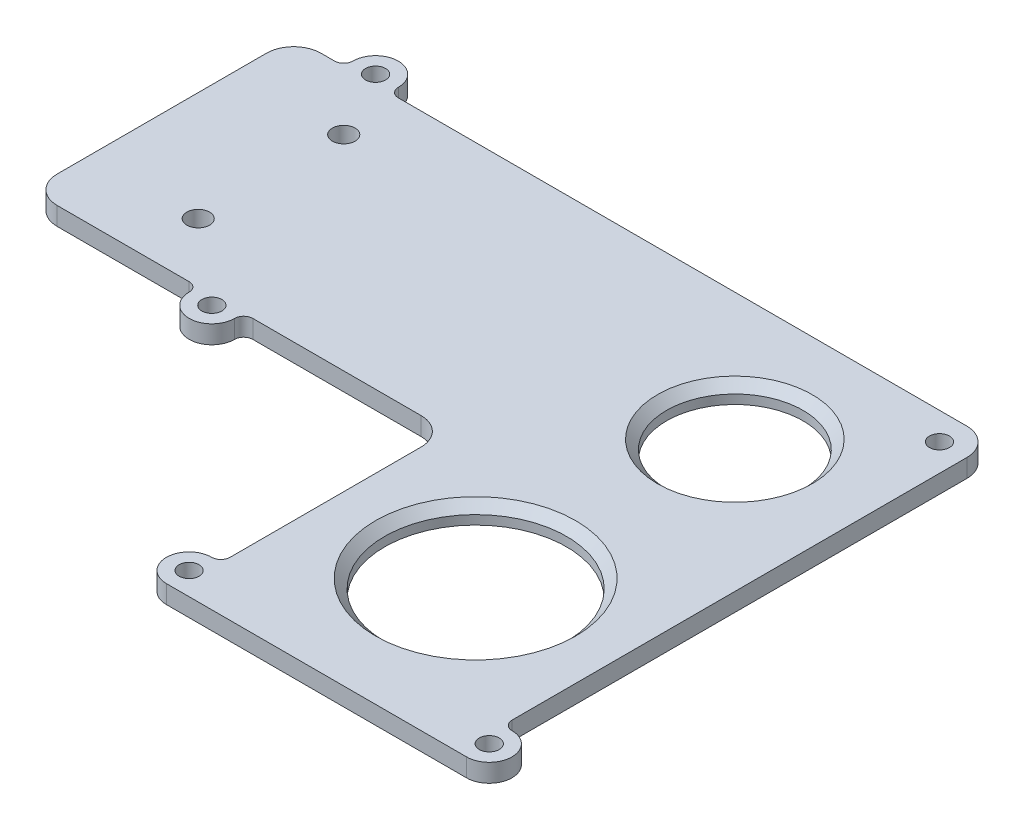
ISO-10303-21;
HEADER;
FILE_DESCRIPTION(('STEP AP214'),'2;1');
FILE_NAME('part.step','',(''),(''),'','','');
FILE_SCHEMA(('AUTOMOTIVE_DESIGN { 1 0 10303 214 1 1 1 1 }'));
ENDSEC;
DATA;
#1=APPLICATION_CONTEXT('core data for automotive mechanical design processes');
#2=APPLICATION_PROTOCOL_DEFINITION('international standard','automotive_design',2000,#1);
#3=PRODUCT_CONTEXT('',#1,'mechanical');
#4=PRODUCT('Part','Part','',(#3));
#5=PRODUCT_RELATED_PRODUCT_CATEGORY('part','',(#4));
#6=PRODUCT_DEFINITION_FORMATION('','',#4);
#7=PRODUCT_DEFINITION_CONTEXT('part definition',#1,'design');
#8=PRODUCT_DEFINITION('design','',#6,#7);
#9=PRODUCT_DEFINITION_SHAPE('','',#8);
#10=(LENGTH_UNIT() NAMED_UNIT(*) SI_UNIT(.MILLI.,.METRE.));
#11=(NAMED_UNIT(*) PLANE_ANGLE_UNIT() SI_UNIT($,.RADIAN.));
#12=(NAMED_UNIT(*) SI_UNIT($,.STERADIAN.) SOLID_ANGLE_UNIT());
#13=UNCERTAINTY_MEASURE_WITH_UNIT(LENGTH_MEASURE(1.E-05),#10,'distance_accuracy_value','');
#14=(GEOMETRIC_REPRESENTATION_CONTEXT(3) GLOBAL_UNCERTAINTY_ASSIGNED_CONTEXT((#13)) GLOBAL_UNIT_ASSIGNED_CONTEXT((#10,
#11,#12)) REPRESENTATION_CONTEXT('',''));
#15=CARTESIAN_POINT('',(0.,0.,0.));
#16=DIRECTION('',(0.,0.,1.));
#17=DIRECTION('',(1.,0.,0.));
#18=AXIS2_PLACEMENT_3D('',#15,#16,#17);
#19=CARTESIAN_POINT('',(32.,2.,-2.49999999999999));
#20=DIRECTION('',(0.,1.,0.));
#21=DIRECTION('',(0.,0.,1.));
#22=AXIS2_PLACEMENT_3D('',#19,#20,#21);
#23=PLANE('',#22);
#24=CARTESIAN_POINT('',(-34.,2.,-52.5));
#25=DIRECTION('',(0.,1.,0.));
#26=DIRECTION('',(0.,0.,1.));
#27=AXIS2_PLACEMENT_3D('',#24,#25,#26);
#28=CIRCLE('',#27,1.25);
#29=CARTESIAN_POINT('',(-34.,2.,-51.25));
#30=VERTEX_POINT('',#29);
#31=EDGE_CURVE('E862',#30,#30,#28,.T.);
#32=ORIENTED_EDGE('',*,*,#31,.F.);
#33=EDGE_LOOP('',(#32));
#34=FACE_BOUND('',#33,.T.);
#35=CARTESIAN_POINT('',(-34.,2.,-36.5));
#36=DIRECTION('',(0.,1.,0.));
#37=DIRECTION('',(0.,0.,1.));
#38=AXIS2_PLACEMENT_3D('',#35,#36,#37);
#39=CIRCLE('',#38,1.25);
#40=CARTESIAN_POINT('',(-34.,2.,-35.25));
#41=VERTEX_POINT('',#40);
#42=EDGE_CURVE('E863',#41,#41,#39,.T.);
#43=ORIENTED_EDGE('',*,*,#42,.F.);
#44=EDGE_LOOP('',(#43));
#45=FACE_BOUND('',#44,.T.);
#46=CARTESIAN_POINT('',(16.4999999999999,2.,-45.0000000000001));
#47=DIRECTION('',(0.,1.,0.));
#48=DIRECTION('',(0.,0.,1.));
#49=AXIS2_PLACEMENT_3D('',#46,#47,#48);
#50=CIRCLE('',#49,8.50000000000001);
#51=CARTESIAN_POINT('',(16.4999999999999,2.,-36.5000000000001));
#52=VERTEX_POINT('',#51);
#53=EDGE_CURVE('E49',#52,#52,#50,.F.);
#54=ORIENTED_EDGE('',*,*,#53,.T.);
#55=EDGE_LOOP('',(#54));
#56=FACE_BOUND('',#55,.T.);
#57=CARTESIAN_POINT('',(15.5,2.,-17.5));
#58=DIRECTION('',(0.,1.,0.));
#59=DIRECTION('',(0.,0.,1.));
#60=AXIS2_PLACEMENT_3D('',#57,#58,#59);
#61=CIRCLE('',#60,11.);
#62=CARTESIAN_POINT('',(15.5,2.,-6.49999999999998));
#63=VERTEX_POINT('',#62);
#64=EDGE_CURVE('E324',#63,#63,#61,.F.);
#65=ORIENTED_EDGE('',*,*,#64,.T.);
#66=EDGE_LOOP('',(#65));
#67=FACE_BOUND('',#66,.T.);
#68=CARTESIAN_POINT('',(-25.,2.,-29.));
#69=DIRECTION('',(0.,1.,0.));
#70=DIRECTION('',(0.,0.,-1.));
#71=AXIS2_PLACEMENT_3D('',#68,#69,#70);
#72=CIRCLE('',#71,1.1);
#73=CARTESIAN_POINT('',(-25.,2.,-30.1));
#74=VERTEX_POINT('',#73);
#75=EDGE_CURVE('E879',#74,#74,#72,.T.);
#76=ORIENTED_EDGE('',*,*,#75,.F.);
#77=EDGE_LOOP('',(#76));
#78=FACE_BOUND('',#77,.T.);
#79=CARTESIAN_POINT('',(28.,2.,-56.));
#80=DIRECTION('',(0.,1.,0.));
#81=DIRECTION('',(0.,0.,1.));
#82=AXIS2_PLACEMENT_3D('',#79,#80,#81);
#83=CIRCLE('',#82,1.1);
#84=CARTESIAN_POINT('',(28.,2.,-54.9));
#85=VERTEX_POINT('',#84);
#86=EDGE_CURVE('E891',#85,#85,#83,.T.);
#87=ORIENTED_EDGE('',*,*,#86,.F.);
#88=EDGE_LOOP('',(#87));
#89=FACE_BOUND('',#88,.T.);
#90=DIRECTION('',(1.,0.,0.));
#91=VECTOR('',#90,1.);
#92=CARTESIAN_POINT('',(-0.999999999999987,2.,0.));
#93=LINE('',#92,#91);
#94=CARTESIAN_POINT('',(-0.999999999999987,2.,0.));
#95=VERTEX_POINT('',#94);
#96=CARTESIAN_POINT('',(32.,2.,0.));
#97=VERTEX_POINT('',#96);
#98=EDGE_CURVE('E141',#95,#97,#93,.T.);
#99=ORIENTED_EDGE('',*,*,#98,.T.);
#100=CARTESIAN_POINT('',(32.,2.,-2.49999999999999));
#101=DIRECTION('',(0.,1.,0.));
#102=DIRECTION('',(0.,0.,1.));
#103=AXIS2_PLACEMENT_3D('',#100,#101,#102);
#104=CIRCLE('',#103,2.5);
#105=CARTESIAN_POINT('',(32.,2.,-4.99999999999999));
#106=VERTEX_POINT('',#105);
#107=EDGE_CURVE('E357',#97,#106,#104,.T.);
#108=ORIENTED_EDGE('',*,*,#107,.T.);
#109=CARTESIAN_POINT('',(32.,2.,-5.99999999999999));
#110=DIRECTION('',(0.,-1.,0.));
#111=DIRECTION('',(0.,0.,-1.));
#112=AXIS2_PLACEMENT_3D('',#109,#110,#111);
#113=CIRCLE('',#112,0.999999999999999);
#114=CARTESIAN_POINT('',(31.,2.,-5.99999999999999));
#115=VERTEX_POINT('',#114);
#116=EDGE_CURVE('E359',#106,#115,#113,.T.);
#117=ORIENTED_EDGE('',*,*,#116,.T.);
#118=DIRECTION('',(0.,0.,-1.));
#119=VECTOR('',#118,1.);
#120=CARTESIAN_POINT('',(31.,2.,-5.99999999999999));
#121=LINE('',#120,#119);
#122=CARTESIAN_POINT('',(31.,2.,-56.));
#123=VERTEX_POINT('',#122);
#124=EDGE_CURVE('E361',#115,#123,#121,.T.);
#125=ORIENTED_EDGE('',*,*,#124,.T.);
#126=CARTESIAN_POINT('',(28.,2.,-56.));
#127=DIRECTION('',(0.,1.,0.));
#128=DIRECTION('',(0.,0.,1.));
#129=AXIS2_PLACEMENT_3D('',#126,#127,#128);
#130=CIRCLE('',#129,3.);
#131=CARTESIAN_POINT('',(28.,2.,-59.));
#132=VERTEX_POINT('',#131);
#133=EDGE_CURVE('E363',#123,#132,#130,.T.);
#134=ORIENTED_EDGE('',*,*,#133,.T.);
#135=DIRECTION('',(-1.,0.,0.));
#136=VECTOR('',#135,1.);
#137=CARTESIAN_POINT('',(28.,2.,-59.));
#138=LINE('',#137,#136);
#139=CARTESIAN_POINT('',(-34.5,2.,-59.));
#140=VERTEX_POINT('',#139);
#141=EDGE_CURVE('E365',#132,#140,#138,.T.);
#142=ORIENTED_EDGE('',*,*,#141,.T.);
#143=CARTESIAN_POINT('',(-34.5,2.,-60.));
#144=DIRECTION('',(0.,-1.,0.));
#145=DIRECTION('',(0.,0.,1.));
#146=AXIS2_PLACEMENT_3D('',#143,#144,#145);
#147=CIRCLE('',#146,1.00000000000003);
#148=CARTESIAN_POINT('',(-35.5,2.,-60.));
#149=VERTEX_POINT('',#148);
#150=EDGE_CURVE('E367',#140,#149,#147,.T.);
#151=ORIENTED_EDGE('',*,*,#150,.T.);
#152=CARTESIAN_POINT('',(-38.,2.,-60.));
#153=DIRECTION('',(0.,1.,0.));
#154=DIRECTION('',(0.,0.,1.));
#155=AXIS2_PLACEMENT_3D('',#152,#153,#154);
#156=CIRCLE('',#155,2.5);
#157=CARTESIAN_POINT('',(-40.5,2.,-60.));
#158=VERTEX_POINT('',#157);
#159=EDGE_CURVE('E369',#149,#158,#156,.T.);
#160=ORIENTED_EDGE('',*,*,#159,.T.);
#161=CARTESIAN_POINT('',(-41.5000000000001,2.,-60.));
#162=DIRECTION('',(0.,-1.,0.));
#163=DIRECTION('',(0.,0.,-1.));
#164=AXIS2_PLACEMENT_3D('',#161,#162,#163);
#165=CIRCLE('',#164,1.00000000000003);
#166=CARTESIAN_POINT('',(-41.5000000000001,2.,-59.));
#167=VERTEX_POINT('',#166);
#168=EDGE_CURVE('E371',#158,#167,#165,.T.);
#169=ORIENTED_EDGE('',*,*,#168,.T.);
#170=DIRECTION('',(-1.,0.,0.));
#171=VECTOR('',#170,1.);
#172=CARTESIAN_POINT('',(-41.5000000000001,2.,-59.));
#173=LINE('',#172,#171);
#174=CARTESIAN_POINT('',(-43.,2.,-59.));
#175=VERTEX_POINT('',#174);
#176=EDGE_CURVE('E373',#167,#175,#173,.T.);
#177=ORIENTED_EDGE('',*,*,#176,.T.);
#178=CARTESIAN_POINT('',(-43.,2.,-56.));
#179=DIRECTION('',(0.,1.,0.));
#180=DIRECTION('',(0.,0.,1.));
#181=AXIS2_PLACEMENT_3D('',#178,#179,#180);
#182=CIRCLE('',#181,3.00000000000001);
#183=CARTESIAN_POINT('',(-46.,2.,-56.));
#184=VERTEX_POINT('',#183);
#185=EDGE_CURVE('E375',#175,#184,#182,.T.);
#186=ORIENTED_EDGE('',*,*,#185,.T.);
#187=DIRECTION('',(0.,0.,1.));
#188=VECTOR('',#187,1.);
#189=CARTESIAN_POINT('',(-46.,2.,-56.));
#190=LINE('',#189,#188);
#191=CARTESIAN_POINT('',(-46.,2.,-33.));
#192=VERTEX_POINT('',#191);
#193=EDGE_CURVE('E377',#184,#192,#190,.T.);
#194=ORIENTED_EDGE('',*,*,#193,.T.);
#195=CARTESIAN_POINT('',(-43.,2.,-33.));
#196=DIRECTION('',(0.,1.,0.));
#197=DIRECTION('',(0.,0.,-1.));
#198=AXIS2_PLACEMENT_3D('',#195,#196,#197);
#199=CIRCLE('',#198,3.00000000000001);
#200=CARTESIAN_POINT('',(-43.,2.,-30.));
#201=VERTEX_POINT('',#200);
#202=EDGE_CURVE('E379',#192,#201,#199,.T.);
#203=ORIENTED_EDGE('',*,*,#202,.T.);
#204=DIRECTION('',(1.,0.,0.));
#205=VECTOR('',#204,1.);
#206=CARTESIAN_POINT('',(-43.,2.,-30.));
#207=LINE('',#206,#205);
#208=CARTESIAN_POINT('',(-28.5,2.,-30.));
#209=VERTEX_POINT('',#208);
#210=EDGE_CURVE('E381',#201,#209,#207,.T.);
#211=ORIENTED_EDGE('',*,*,#210,.T.);
#212=CARTESIAN_POINT('',(-28.5,2.,-29.));
#213=DIRECTION('',(0.,-1.,0.));
#214=DIRECTION('',(0.,0.,1.));
#215=AXIS2_PLACEMENT_3D('',#212,#213,#214);
#216=CIRCLE('',#215,1.);
#217=CARTESIAN_POINT('',(-27.5,2.,-29.));
#218=VERTEX_POINT('',#217);
#219=EDGE_CURVE('E383',#209,#218,#216,.T.);
#220=ORIENTED_EDGE('',*,*,#219,.T.);
#221=CARTESIAN_POINT('',(-25.,2.,-29.));
#222=DIRECTION('',(0.,1.,0.));
#223=DIRECTION('',(0.,0.,-1.));
#224=AXIS2_PLACEMENT_3D('',#221,#222,#223);
#225=CIRCLE('',#224,2.5);
#226=CARTESIAN_POINT('',(-22.5,2.,-29.));
#227=VERTEX_POINT('',#226);
#228=EDGE_CURVE('E385',#218,#227,#225,.T.);
#229=ORIENTED_EDGE('',*,*,#228,.T.);
#230=CARTESIAN_POINT('',(-21.5,2.,-29.));
#231=DIRECTION('',(0.,-1.,0.));
#232=DIRECTION('',(0.,0.,-1.));
#233=AXIS2_PLACEMENT_3D('',#230,#231,#232);
#234=CIRCLE('',#233,1.);
#235=CARTESIAN_POINT('',(-21.5,2.,-30.));
#236=VERTEX_POINT('',#235);
#237=EDGE_CURVE('E387',#227,#236,#234,.T.);
#238=ORIENTED_EDGE('',*,*,#237,.T.);
#239=DIRECTION('',(1.,0.,0.));
#240=VECTOR('',#239,1.);
#241=CARTESIAN_POINT('',(-21.5,2.,-30.));
#242=LINE('',#241,#240);
#243=CARTESIAN_POINT('',(-3.,2.,-30.));
#244=VERTEX_POINT('',#243);
#245=EDGE_CURVE('E389',#236,#244,#242,.T.);
#246=ORIENTED_EDGE('',*,*,#245,.T.);
#247=CARTESIAN_POINT('',(-3.,2.,-27.));
#248=DIRECTION('',(0.,-1.,0.));
#249=DIRECTION('',(0.,0.,-1.));
#250=AXIS2_PLACEMENT_3D('',#247,#248,#249);
#251=CIRCLE('',#250,3.);
#252=CARTESIAN_POINT('',(0.,2.,-27.));
#253=VERTEX_POINT('',#252);
#254=EDGE_CURVE('E203',#244,#253,#251,.T.);
#255=ORIENTED_EDGE('',*,*,#254,.T.);
#256=DIRECTION('',(0.,0.,1.));
#257=VECTOR('',#256,1.);
#258=CARTESIAN_POINT('',(0.,2.,-27.));
#259=LINE('',#258,#257);
#260=CARTESIAN_POINT('',(0.,2.,-5.99999999999999));
#261=VERTEX_POINT('',#260);
#262=EDGE_CURVE('E197',#253,#261,#259,.T.);
#263=ORIENTED_EDGE('',*,*,#262,.T.);
#264=CARTESIAN_POINT('',(-1.,2.,-5.99999999999999));
#265=DIRECTION('',(0.,-1.,0.));
#266=DIRECTION('',(0.,0.,1.));
#267=AXIS2_PLACEMENT_3D('',#264,#265,#266);
#268=CIRCLE('',#267,0.999999999999999);
#269=CARTESIAN_POINT('',(-0.999999999999994,2.,-4.99999999999999));
#270=VERTEX_POINT('',#269);
#271=EDGE_CURVE('E201',#261,#270,#268,.T.);
#272=ORIENTED_EDGE('',*,*,#271,.T.);
#273=CARTESIAN_POINT('',(-0.999999999999987,2.,-2.49999999999999));
#274=DIRECTION('',(0.,1.,0.));
#275=DIRECTION('',(0.,0.,-1.));
#276=AXIS2_PLACEMENT_3D('',#273,#274,#275);
#277=CIRCLE('',#276,2.5);
#278=EDGE_CURVE('E57',#270,#95,#277,.T.);
#279=ORIENTED_EDGE('',*,*,#278,.T.);
#280=EDGE_LOOP('',(#99,#108,#117,#125,#134,#142,#151,#160,#169,#177,#186,#194,#203,#211,#220,
#229,#238,#246,#255,#263,#272,#279));
#281=FACE_BOUND('',#280,.T.);
#282=CARTESIAN_POINT('',(32.,2.,-2.49999999999999));
#283=DIRECTION('',(0.,1.,0.));
#284=DIRECTION('',(0.,0.,1.));
#285=AXIS2_PLACEMENT_3D('',#282,#283,#284);
#286=CIRCLE('',#285,1.1);
#287=CARTESIAN_POINT('',(32.,2.,-1.39999999999999));
#288=VERTEX_POINT('',#287);
#289=EDGE_CURVE('E347',#288,#288,#286,.T.);
#290=ORIENTED_EDGE('',*,*,#289,.F.);
#291=EDGE_LOOP('',(#290));
#292=FACE_BOUND('',#291,.T.);
#293=CARTESIAN_POINT('',(-0.999999999999987,2.,-2.49999999999999));
#294=DIRECTION('',(0.,1.,0.));
#295=DIRECTION('',(0.,0.,-1.));
#296=AXIS2_PLACEMENT_3D('',#293,#294,#295);
#297=CIRCLE('',#296,1.1);
#298=CARTESIAN_POINT('',(-0.999999999999987,2.,-3.59999999999999));
#299=VERTEX_POINT('',#298);
#300=EDGE_CURVE('E885',#299,#299,#297,.T.);
#301=ORIENTED_EDGE('',*,*,#300,.F.);
#302=EDGE_LOOP('',(#301));
#303=FACE_BOUND('',#302,.T.);
#304=CARTESIAN_POINT('',(-38.,2.,-60.));
#305=DIRECTION('',(0.,1.,0.));
#306=DIRECTION('',(0.,0.,1.));
#307=AXIS2_PLACEMENT_3D('',#304,#305,#306);
#308=CIRCLE('',#307,1.1);
#309=CARTESIAN_POINT('',(-38.,2.,-58.9));
#310=VERTEX_POINT('',#309);
#311=EDGE_CURVE('E873',#310,#310,#308,.T.);
#312=ORIENTED_EDGE('',*,*,#311,.F.);
#313=EDGE_LOOP('',(#312));
#314=FACE_BOUND('',#313,.T.);
#315=ADVANCED_FACE('F39',(#34,#45,#56,#67,#78,#89,#281,#292,#303,#314),#23,.T.);
#316=CARTESIAN_POINT('',(32.,0.,-2.49999999999999));
#317=DIRECTION('',(0.,1.,0.));
#318=DIRECTION('',(0.,0.,1.));
#319=AXIS2_PLACEMENT_3D('',#316,#317,#318);
#320=PLANE('',#319);
#321=CARTESIAN_POINT('',(-34.,0.,-52.5));
#322=DIRECTION('',(0.,1.,0.));
#323=DIRECTION('',(0.,0.,1.));
#324=AXIS2_PLACEMENT_3D('',#321,#322,#323);
#325=CIRCLE('',#324,1.25);
#326=CARTESIAN_POINT('',(-34.,0.,-51.25));
#327=VERTEX_POINT('',#326);
#328=EDGE_CURVE('E860',#327,#327,#325,.T.);
#329=ORIENTED_EDGE('',*,*,#328,.T.);
#330=EDGE_LOOP('',(#329));
#331=FACE_BOUND('',#330,.T.);
#332=CARTESIAN_POINT('',(-34.,0.,-36.5));
#333=DIRECTION('',(0.,1.,0.));
#334=DIRECTION('',(0.,0.,1.));
#335=AXIS2_PLACEMENT_3D('',#332,#333,#334);
#336=CIRCLE('',#335,1.25);
#337=CARTESIAN_POINT('',(-34.,0.,-35.25));
#338=VERTEX_POINT('',#337);
#339=EDGE_CURVE('E868',#338,#338,#336,.T.);
#340=ORIENTED_EDGE('',*,*,#339,.T.);
#341=EDGE_LOOP('',(#340));
#342=FACE_BOUND('',#341,.T.);
#343=DIRECTION('',(1.,0.,0.));
#344=VECTOR('',#343,1.);
#345=CARTESIAN_POINT('',(32.,0.,0.));
#346=LINE('',#345,#344);
#347=CARTESIAN_POINT('',(-0.999999999999987,0.,0.));
#348=VERTEX_POINT('',#347);
#349=CARTESIAN_POINT('',(32.,0.,0.));
#350=VERTEX_POINT('',#349);
#351=EDGE_CURVE('E135',#348,#350,#346,.T.);
#352=ORIENTED_EDGE('',*,*,#351,.F.);
#353=CARTESIAN_POINT('',(-0.999999999999987,0.,-2.49999999999999));
#354=DIRECTION('',(0.,1.,0.));
#355=DIRECTION('',(0.,0.,-1.));
#356=AXIS2_PLACEMENT_3D('',#353,#354,#355);
#357=CIRCLE('',#356,2.5);
#358=CARTESIAN_POINT('',(-0.999999999999994,0.,-4.99999999999999));
#359=VERTEX_POINT('',#358);
#360=EDGE_CURVE('E261',#359,#348,#357,.T.);
#361=ORIENTED_EDGE('',*,*,#360,.F.);
#362=CARTESIAN_POINT('',(-1.,0.,-5.99999999999999));
#363=DIRECTION('',(0.,-1.,0.));
#364=DIRECTION('',(0.,0.,1.));
#365=AXIS2_PLACEMENT_3D('',#362,#363,#364);
#366=CIRCLE('',#365,0.999999999999999);
#367=CARTESIAN_POINT('',(0.,0.,-5.99999999999999));
#368=VERTEX_POINT('',#367);
#369=EDGE_CURVE('E128',#368,#359,#366,.T.);
#370=ORIENTED_EDGE('',*,*,#369,.F.);
#371=DIRECTION('',(0.,0.,1.));
#372=VECTOR('',#371,1.);
#373=CARTESIAN_POINT('',(0.,0.,-27.));
#374=LINE('',#373,#372);
#375=CARTESIAN_POINT('',(0.,0.,-27.));
#376=VERTEX_POINT('',#375);
#377=EDGE_CURVE('E211',#376,#368,#374,.T.);
#378=ORIENTED_EDGE('',*,*,#377,.F.);
#379=CARTESIAN_POINT('',(-3.,0.,-27.));
#380=DIRECTION('',(0.,-1.,0.));
#381=DIRECTION('',(0.,0.,-1.));
#382=AXIS2_PLACEMENT_3D('',#379,#380,#381);
#383=CIRCLE('',#382,3.);
#384=CARTESIAN_POINT('',(-3.,0.,-30.));
#385=VERTEX_POINT('',#384);
#386=EDGE_CURVE('E257',#385,#376,#383,.T.);
#387=ORIENTED_EDGE('',*,*,#386,.F.);
#388=DIRECTION('',(1.,0.,0.));
#389=VECTOR('',#388,1.);
#390=CARTESIAN_POINT('',(-21.5,0.,-30.));
#391=LINE('',#390,#389);
#392=CARTESIAN_POINT('',(-21.5,0.,-30.));
#393=VERTEX_POINT('',#392);
#394=EDGE_CURVE('E255',#393,#385,#391,.T.);
#395=ORIENTED_EDGE('',*,*,#394,.F.);
#396=CARTESIAN_POINT('',(-21.5,0.,-29.));
#397=DIRECTION('',(0.,-1.,0.));
#398=DIRECTION('',(0.,0.,-1.));
#399=AXIS2_PLACEMENT_3D('',#396,#397,#398);
#400=CIRCLE('',#399,1.);
#401=CARTESIAN_POINT('',(-22.5,0.,-29.));
#402=VERTEX_POINT('',#401);
#403=EDGE_CURVE('E253',#402,#393,#400,.T.);
#404=ORIENTED_EDGE('',*,*,#403,.F.);
#405=CARTESIAN_POINT('',(-25.,0.,-29.));
#406=DIRECTION('',(0.,1.,0.));
#407=DIRECTION('',(0.,0.,-1.));
#408=AXIS2_PLACEMENT_3D('',#405,#406,#407);
#409=CIRCLE('',#408,2.5);
#410=CARTESIAN_POINT('',(-27.5,0.,-29.));
#411=VERTEX_POINT('',#410);
#412=EDGE_CURVE('E251',#411,#402,#409,.T.);
#413=ORIENTED_EDGE('',*,*,#412,.F.);
#414=CARTESIAN_POINT('',(-28.5,0.,-29.));
#415=DIRECTION('',(0.,-1.,0.));
#416=DIRECTION('',(0.,0.,1.));
#417=AXIS2_PLACEMENT_3D('',#414,#415,#416);
#418=CIRCLE('',#417,1.);
#419=CARTESIAN_POINT('',(-28.5,0.,-30.));
#420=VERTEX_POINT('',#419);
#421=EDGE_CURVE('E249',#420,#411,#418,.T.);
#422=ORIENTED_EDGE('',*,*,#421,.F.);
#423=DIRECTION('',(1.,0.,0.));
#424=VECTOR('',#423,1.);
#425=CARTESIAN_POINT('',(-43.,0.,-30.));
#426=LINE('',#425,#424);
#427=CARTESIAN_POINT('',(-43.,0.,-30.));
#428=VERTEX_POINT('',#427);
#429=EDGE_CURVE('E247',#428,#420,#426,.T.);
#430=ORIENTED_EDGE('',*,*,#429,.F.);
#431=CARTESIAN_POINT('',(-43.,0.,-33.));
#432=DIRECTION('',(0.,1.,0.));
#433=DIRECTION('',(0.,0.,-1.));
#434=AXIS2_PLACEMENT_3D('',#431,#432,#433);
#435=CIRCLE('',#434,3.00000000000001);
#436=CARTESIAN_POINT('',(-46.,0.,-33.));
#437=VERTEX_POINT('',#436);
#438=EDGE_CURVE('E245',#437,#428,#435,.T.);
#439=ORIENTED_EDGE('',*,*,#438,.F.);
#440=DIRECTION('',(0.,0.,1.));
#441=VECTOR('',#440,1.);
#442=CARTESIAN_POINT('',(-46.,0.,-56.));
#443=LINE('',#442,#441);
#444=CARTESIAN_POINT('',(-46.,0.,-56.));
#445=VERTEX_POINT('',#444);
#446=EDGE_CURVE('E243',#445,#437,#443,.T.);
#447=ORIENTED_EDGE('',*,*,#446,.F.);
#448=CARTESIAN_POINT('',(-43.,0.,-56.));
#449=DIRECTION('',(0.,1.,0.));
#450=DIRECTION('',(0.,0.,1.));
#451=AXIS2_PLACEMENT_3D('',#448,#449,#450);
#452=CIRCLE('',#451,3.00000000000001);
#453=CARTESIAN_POINT('',(-43.,0.,-59.));
#454=VERTEX_POINT('',#453);
#455=EDGE_CURVE('E241',#454,#445,#452,.T.);
#456=ORIENTED_EDGE('',*,*,#455,.F.);
#457=DIRECTION('',(-1.,0.,0.));
#458=VECTOR('',#457,1.);
#459=CARTESIAN_POINT('',(-41.5000000000001,0.,-59.));
#460=LINE('',#459,#458);
#461=CARTESIAN_POINT('',(-41.5000000000001,0.,-59.));
#462=VERTEX_POINT('',#461);
#463=EDGE_CURVE('E239',#462,#454,#460,.T.);
#464=ORIENTED_EDGE('',*,*,#463,.F.);
#465=CARTESIAN_POINT('',(-41.5000000000001,0.,-60.));
#466=DIRECTION('',(0.,-1.,0.));
#467=DIRECTION('',(0.,0.,-1.));
#468=AXIS2_PLACEMENT_3D('',#465,#466,#467);
#469=CIRCLE('',#468,1.00000000000003);
#470=CARTESIAN_POINT('',(-40.5,0.,-60.));
#471=VERTEX_POINT('',#470);
#472=EDGE_CURVE('E237',#471,#462,#469,.T.);
#473=ORIENTED_EDGE('',*,*,#472,.F.);
#474=CARTESIAN_POINT('',(-38.,0.,-60.));
#475=DIRECTION('',(0.,1.,0.));
#476=DIRECTION('',(0.,0.,1.));
#477=AXIS2_PLACEMENT_3D('',#474,#475,#476);
#478=CIRCLE('',#477,2.5);
#479=CARTESIAN_POINT('',(-35.5,0.,-60.));
#480=VERTEX_POINT('',#479);
#481=EDGE_CURVE('E235',#480,#471,#478,.T.);
#482=ORIENTED_EDGE('',*,*,#481,.F.);
#483=CARTESIAN_POINT('',(-34.5,0.,-60.));
#484=DIRECTION('',(0.,-1.,0.));
#485=DIRECTION('',(0.,0.,1.));
#486=AXIS2_PLACEMENT_3D('',#483,#484,#485);
#487=CIRCLE('',#486,1.00000000000003);
#488=CARTESIAN_POINT('',(-34.5,0.,-59.));
#489=VERTEX_POINT('',#488);
#490=EDGE_CURVE('E233',#489,#480,#487,.T.);
#491=ORIENTED_EDGE('',*,*,#490,.F.);
#492=DIRECTION('',(-1.,0.,0.));
#493=VECTOR('',#492,1.);
#494=CARTESIAN_POINT('',(28.,0.,-59.));
#495=LINE('',#494,#493);
#496=CARTESIAN_POINT('',(28.,0.,-59.));
#497=VERTEX_POINT('',#496);
#498=EDGE_CURVE('E231',#497,#489,#495,.T.);
#499=ORIENTED_EDGE('',*,*,#498,.F.);
#500=CARTESIAN_POINT('',(28.,0.,-56.));
#501=DIRECTION('',(0.,1.,0.));
#502=DIRECTION('',(0.,0.,1.));
#503=AXIS2_PLACEMENT_3D('',#500,#501,#502);
#504=CIRCLE('',#503,3.);
#505=CARTESIAN_POINT('',(31.,0.,-56.));
#506=VERTEX_POINT('',#505);
#507=EDGE_CURVE('E229',#506,#497,#504,.T.);
#508=ORIENTED_EDGE('',*,*,#507,.F.);
#509=DIRECTION('',(0.,0.,-1.));
#510=VECTOR('',#509,1.);
#511=CARTESIAN_POINT('',(31.,0.,-5.99999999999999));
#512=LINE('',#511,#510);
#513=CARTESIAN_POINT('',(31.,0.,-5.99999999999999));
#514=VERTEX_POINT('',#513);
#515=EDGE_CURVE('E227',#514,#506,#512,.T.);
#516=ORIENTED_EDGE('',*,*,#515,.F.);
#517=CARTESIAN_POINT('',(32.,0.,-5.99999999999999));
#518=DIRECTION('',(0.,-1.,0.));
#519=DIRECTION('',(0.,0.,-1.));
#520=AXIS2_PLACEMENT_3D('',#517,#518,#519);
#521=CIRCLE('',#520,0.999999999999999);
#522=CARTESIAN_POINT('',(32.,0.,-4.99999999999999));
#523=VERTEX_POINT('',#522);
#524=EDGE_CURVE('E225',#523,#514,#521,.T.);
#525=ORIENTED_EDGE('',*,*,#524,.F.);
#526=CARTESIAN_POINT('',(32.,0.,-2.49999999999999));
#527=DIRECTION('',(0.,1.,0.));
#528=DIRECTION('',(0.,0.,1.));
#529=AXIS2_PLACEMENT_3D('',#526,#527,#528);
#530=CIRCLE('',#529,2.5);
#531=EDGE_CURVE('E222',#350,#523,#530,.T.);
#532=ORIENTED_EDGE('',*,*,#531,.F.);
#533=EDGE_LOOP('',(#352,#361,#370,#378,#387,#395,#404,#413,#422,#430,#439,#447,#456,#464,#473,
#482,#491,#499,#508,#516,#525,#532));
#534=FACE_BOUND('',#533,.T.);
#535=CARTESIAN_POINT('',(15.5,0.,-17.5));
#536=DIRECTION('',(0.,1.,0.));
#537=DIRECTION('',(0.,0.,1.));
#538=AXIS2_PLACEMENT_3D('',#535,#536,#537);
#539=CIRCLE('',#538,10.);
#540=CARTESIAN_POINT('',(15.5,0.,-7.49999999999999));
#541=VERTEX_POINT('',#540);
#542=EDGE_CURVE('E223',#541,#541,#539,.T.);
#543=ORIENTED_EDGE('',*,*,#542,.T.);
#544=EDGE_LOOP('',(#543));
#545=FACE_BOUND('',#544,.T.);
#546=CARTESIAN_POINT('',(16.4999999999999,0.,-45.0000000000001));
#547=DIRECTION('',(0.,1.,0.));
#548=DIRECTION('',(0.,0.,1.));
#549=AXIS2_PLACEMENT_3D('',#546,#547,#548);
#550=CIRCLE('',#549,7.5);
#551=CARTESIAN_POINT('',(16.4999999999999,0.,-37.5000000000001));
#552=VERTEX_POINT('',#551);
#553=EDGE_CURVE('E345',#552,#552,#550,.T.);
#554=ORIENTED_EDGE('',*,*,#553,.T.);
#555=EDGE_LOOP('',(#554));
#556=FACE_BOUND('',#555,.T.);
#557=CARTESIAN_POINT('',(32.,0.,-2.49999999999999));
#558=DIRECTION('',(0.,1.,0.));
#559=DIRECTION('',(0.,0.,1.));
#560=AXIS2_PLACEMENT_3D('',#557,#558,#559);
#561=CIRCLE('',#560,1.1);
#562=CARTESIAN_POINT('',(32.,0.,-1.39999999999999));
#563=VERTEX_POINT('',#562);
#564=EDGE_CURVE('E352',#563,#563,#561,.T.);
#565=ORIENTED_EDGE('',*,*,#564,.T.);
#566=EDGE_LOOP('',(#565));
#567=FACE_BOUND('',#566,.T.);
#568=CARTESIAN_POINT('',(28.,0.,-56.));
#569=DIRECTION('',(0.,1.,0.));
#570=DIRECTION('',(0.,0.,1.));
#571=AXIS2_PLACEMENT_3D('',#568,#569,#570);
#572=CIRCLE('',#571,1.1);
#573=CARTESIAN_POINT('',(28.,0.,-54.9));
#574=VERTEX_POINT('',#573);
#575=EDGE_CURVE('E888',#574,#574,#572,.T.);
#576=ORIENTED_EDGE('',*,*,#575,.T.);
#577=EDGE_LOOP('',(#576));
#578=FACE_BOUND('',#577,.T.);
#579=CARTESIAN_POINT('',(-0.999999999999987,0.,-2.49999999999999));
#580=DIRECTION('',(0.,1.,0.));
#581=DIRECTION('',(0.,0.,-1.));
#582=AXIS2_PLACEMENT_3D('',#579,#580,#581);
#583=CIRCLE('',#582,1.1);
#584=CARTESIAN_POINT('',(-0.999999999999987,0.,-3.59999999999999));
#585=VERTEX_POINT('',#584);
#586=EDGE_CURVE('E882',#585,#585,#583,.T.);
#587=ORIENTED_EDGE('',*,*,#586,.T.);
#588=EDGE_LOOP('',(#587));
#589=FACE_BOUND('',#588,.T.);
#590=CARTESIAN_POINT('',(-25.,0.,-29.));
#591=DIRECTION('',(0.,1.,0.));
#592=DIRECTION('',(0.,0.,-1.));
#593=AXIS2_PLACEMENT_3D('',#590,#591,#592);
#594=CIRCLE('',#593,1.1);
#595=CARTESIAN_POINT('',(-25.,0.,-30.1));
#596=VERTEX_POINT('',#595);
#597=EDGE_CURVE('E876',#596,#596,#594,.T.);
#598=ORIENTED_EDGE('',*,*,#597,.T.);
#599=EDGE_LOOP('',(#598));
#600=FACE_BOUND('',#599,.T.);
#601=CARTESIAN_POINT('',(-38.,0.,-60.));
#602=DIRECTION('',(0.,1.,0.));
#603=DIRECTION('',(0.,0.,1.));
#604=AXIS2_PLACEMENT_3D('',#601,#602,#603);
#605=CIRCLE('',#604,1.1);
#606=CARTESIAN_POINT('',(-38.,0.,-58.9));
#607=VERTEX_POINT('',#606);
#608=EDGE_CURVE('E865',#607,#607,#605,.T.);
#609=ORIENTED_EDGE('',*,*,#608,.T.);
#610=EDGE_LOOP('',(#609));
#611=FACE_BOUND('',#610,.T.);
#612=ADVANCED_FACE('F400',(#331,#342,#534,#545,#556,#567,#578,#589,#600,#611),#320,.F.);
#613=CARTESIAN_POINT('',(32.,2.,0.));
#614=DIRECTION('',(0.,0.,-1.));
#615=DIRECTION('',(-1.,0.,0.));
#616=AXIS2_PLACEMENT_3D('',#613,#614,#615);
#617=PLANE('',#616);
#618=ORIENTED_EDGE('',*,*,#351,.T.);
#619=DIRECTION('',(0.,-1.,0.));
#620=VECTOR('',#619,1.);
#621=CARTESIAN_POINT('',(32.,2.,0.));
#622=LINE('',#621,#620);
#623=EDGE_CURVE('E318',#97,#350,#622,.T.);
#624=ORIENTED_EDGE('',*,*,#623,.F.);
#625=ORIENTED_EDGE('',*,*,#98,.F.);
#626=DIRECTION('',(0.,-1.,0.));
#627=VECTOR('',#626,1.);
#628=CARTESIAN_POINT('',(-0.999999999999987,2.,0.));
#629=LINE('',#628,#627);
#630=EDGE_CURVE('E217',#95,#348,#629,.T.);
#631=ORIENTED_EDGE('',*,*,#630,.T.);
#632=EDGE_LOOP('',(#618,#624,#625,#631));
#633=FACE_BOUND('',#632,.T.);
#634=ADVANCED_FACE('F405',(#633),#617,.F.);
#635=CARTESIAN_POINT('',(32.,2.,-2.49999999999999));
#636=DIRECTION('',(0.,-1.,0.));
#637=DIRECTION('',(0.,0.,-1.));
#638=AXIS2_PLACEMENT_3D('',#635,#636,#637);
#639=CYLINDRICAL_SURFACE('',#638,2.5);
#640=ORIENTED_EDGE('',*,*,#531,.T.);
#641=DIRECTION('',(0.,-1.,0.));
#642=VECTOR('',#641,1.);
#643=CARTESIAN_POINT('',(32.,2.,-4.99999999999999));
#644=LINE('',#643,#642);
#645=EDGE_CURVE('E315',#106,#523,#644,.T.);
#646=ORIENTED_EDGE('',*,*,#645,.F.);
#647=ORIENTED_EDGE('',*,*,#107,.F.);
#648=ORIENTED_EDGE('',*,*,#623,.T.);
#649=EDGE_LOOP('',(#640,#646,#647,#648));
#650=FACE_BOUND('',#649,.T.);
#651=ADVANCED_FACE('F409',(#650),#639,.T.);
#652=CARTESIAN_POINT('',(32.,2.,-5.99999999999999));
#653=DIRECTION('',(0.,-1.,0.));
#654=DIRECTION('',(0.,0.,-1.));
#655=AXIS2_PLACEMENT_3D('',#652,#653,#654);
#656=CYLINDRICAL_SURFACE('',#655,0.999999999999999);
#657=ORIENTED_EDGE('',*,*,#524,.T.);
#658=DIRECTION('',(0.,-1.,0.));
#659=VECTOR('',#658,1.);
#660=CARTESIAN_POINT('',(31.,2.,-5.99999999999999));
#661=LINE('',#660,#659);
#662=EDGE_CURVE('E312',#115,#514,#661,.T.);
#663=ORIENTED_EDGE('',*,*,#662,.F.);
#664=ORIENTED_EDGE('',*,*,#116,.F.);
#665=ORIENTED_EDGE('',*,*,#645,.T.);
#666=EDGE_LOOP('',(#657,#663,#664,#665));
#667=FACE_BOUND('',#666,.T.);
#668=ADVANCED_FACE('F415',(#667),#656,.F.);
#669=CARTESIAN_POINT('',(31.,2.,-5.99999999999999));
#670=DIRECTION('',(-1.,0.,0.));
#671=DIRECTION('',(0.,0.,1.));
#672=AXIS2_PLACEMENT_3D('',#669,#670,#671);
#673=PLANE('',#672);
#674=ORIENTED_EDGE('',*,*,#515,.T.);
#675=DIRECTION('',(0.,-1.,0.));
#676=VECTOR('',#675,1.);
#677=CARTESIAN_POINT('',(31.,2.,-56.));
#678=LINE('',#677,#676);
#679=EDGE_CURVE('E309',#123,#506,#678,.T.);
#680=ORIENTED_EDGE('',*,*,#679,.F.);
#681=ORIENTED_EDGE('',*,*,#124,.F.);
#682=ORIENTED_EDGE('',*,*,#662,.T.);
#683=EDGE_LOOP('',(#674,#680,#681,#682));
#684=FACE_BOUND('',#683,.T.);
#685=ADVANCED_FACE('F419',(#684),#673,.F.);
#686=CARTESIAN_POINT('',(28.,2.,-56.));
#687=DIRECTION('',(0.,-1.,0.));
#688=DIRECTION('',(0.,0.,-1.));
#689=AXIS2_PLACEMENT_3D('',#686,#687,#688);
#690=CYLINDRICAL_SURFACE('',#689,3.);
#691=ORIENTED_EDGE('',*,*,#507,.T.);
#692=DIRECTION('',(0.,-1.,0.));
#693=VECTOR('',#692,1.);
#694=CARTESIAN_POINT('',(28.,2.,-59.));
#695=LINE('',#694,#693);
#696=EDGE_CURVE('E306',#132,#497,#695,.T.);
#697=ORIENTED_EDGE('',*,*,#696,.F.);
#698=ORIENTED_EDGE('',*,*,#133,.F.);
#699=ORIENTED_EDGE('',*,*,#679,.T.);
#700=EDGE_LOOP('',(#691,#697,#698,#699));
#701=FACE_BOUND('',#700,.T.);
#702=ADVANCED_FACE('F424',(#701),#690,.T.);
#703=CARTESIAN_POINT('',(28.,2.,-59.));
#704=DIRECTION('',(0.,0.,1.));
#705=DIRECTION('',(1.,0.,0.));
#706=AXIS2_PLACEMENT_3D('',#703,#704,#705);
#707=PLANE('',#706);
#708=ORIENTED_EDGE('',*,*,#498,.T.);
#709=DIRECTION('',(0.,-1.,0.));
#710=VECTOR('',#709,1.);
#711=CARTESIAN_POINT('',(-34.5,2.,-59.));
#712=LINE('',#711,#710);
#713=EDGE_CURVE('E303',#140,#489,#712,.T.);
#714=ORIENTED_EDGE('',*,*,#713,.F.);
#715=ORIENTED_EDGE('',*,*,#141,.F.);
#716=ORIENTED_EDGE('',*,*,#696,.T.);
#717=EDGE_LOOP('',(#708,#714,#715,#716));
#718=FACE_BOUND('',#717,.T.);
#719=ADVANCED_FACE('F430',(#718),#707,.F.);
#720=CARTESIAN_POINT('',(-34.5,2.,-60.));
#721=DIRECTION('',(0.,-1.,0.));
#722=DIRECTION('',(0.,0.,-1.));
#723=AXIS2_PLACEMENT_3D('',#720,#721,#722);
#724=CYLINDRICAL_SURFACE('',#723,1.00000000000003);
#725=ORIENTED_EDGE('',*,*,#490,.T.);
#726=DIRECTION('',(0.,-1.,0.));
#727=VECTOR('',#726,1.);
#728=CARTESIAN_POINT('',(-35.5,2.,-60.));
#729=LINE('',#728,#727);
#730=EDGE_CURVE('E300',#149,#480,#729,.T.);
#731=ORIENTED_EDGE('',*,*,#730,.F.);
#732=ORIENTED_EDGE('',*,*,#150,.F.);
#733=ORIENTED_EDGE('',*,*,#713,.T.);
#734=EDGE_LOOP('',(#725,#731,#732,#733));
#735=FACE_BOUND('',#734,.T.);
#736=ADVANCED_FACE('F434',(#735),#724,.F.);
#737=CARTESIAN_POINT('',(-38.,2.,-60.));
#738=DIRECTION('',(0.,-1.,0.));
#739=DIRECTION('',(0.,0.,-1.));
#740=AXIS2_PLACEMENT_3D('',#737,#738,#739);
#741=CYLINDRICAL_SURFACE('',#740,2.5);
#742=ORIENTED_EDGE('',*,*,#481,.T.);
#743=DIRECTION('',(0.,-1.,0.));
#744=VECTOR('',#743,1.);
#745=CARTESIAN_POINT('',(-40.5,2.,-60.));
#746=LINE('',#745,#744);
#747=EDGE_CURVE('E297',#158,#471,#746,.T.);
#748=ORIENTED_EDGE('',*,*,#747,.F.);
#749=ORIENTED_EDGE('',*,*,#159,.F.);
#750=ORIENTED_EDGE('',*,*,#730,.T.);
#751=EDGE_LOOP('',(#742,#748,#749,#750));
#752=FACE_BOUND('',#751,.T.);
#753=ADVANCED_FACE('F439',(#752),#741,.T.);
#754=CARTESIAN_POINT('',(-41.5000000000001,2.,-60.));
#755=DIRECTION('',(0.,-1.,0.));
#756=DIRECTION('',(0.,0.,-1.));
#757=AXIS2_PLACEMENT_3D('',#754,#755,#756);
#758=CYLINDRICAL_SURFACE('',#757,1.00000000000003);
#759=ORIENTED_EDGE('',*,*,#472,.T.);
#760=DIRECTION('',(0.,-1.,0.));
#761=VECTOR('',#760,1.);
#762=CARTESIAN_POINT('',(-41.5000000000001,2.,-59.));
#763=LINE('',#762,#761);
#764=EDGE_CURVE('E294',#167,#462,#763,.T.);
#765=ORIENTED_EDGE('',*,*,#764,.F.);
#766=ORIENTED_EDGE('',*,*,#168,.F.);
#767=ORIENTED_EDGE('',*,*,#747,.T.);
#768=EDGE_LOOP('',(#759,#765,#766,#767));
#769=FACE_BOUND('',#768,.T.);
#770=ADVANCED_FACE('F445',(#769),#758,.F.);
#771=CARTESIAN_POINT('',(-41.5000000000001,2.,-59.));
#772=DIRECTION('',(0.,0.,1.));
#773=DIRECTION('',(1.,0.,0.));
#774=AXIS2_PLACEMENT_3D('',#771,#772,#773);
#775=PLANE('',#774);
#776=ORIENTED_EDGE('',*,*,#463,.T.);
#777=DIRECTION('',(0.,-1.,0.));
#778=VECTOR('',#777,1.);
#779=CARTESIAN_POINT('',(-43.,2.,-59.));
#780=LINE('',#779,#778);
#781=EDGE_CURVE('E291',#175,#454,#780,.T.);
#782=ORIENTED_EDGE('',*,*,#781,.F.);
#783=ORIENTED_EDGE('',*,*,#176,.F.);
#784=ORIENTED_EDGE('',*,*,#764,.T.);
#785=EDGE_LOOP('',(#776,#782,#783,#784));
#786=FACE_BOUND('',#785,.T.);
#787=ADVANCED_FACE('F449',(#786),#775,.F.);
#788=CARTESIAN_POINT('',(-43.,2.,-56.));
#789=DIRECTION('',(0.,-1.,0.));
#790=DIRECTION('',(0.,0.,-1.));
#791=AXIS2_PLACEMENT_3D('',#788,#789,#790);
#792=CYLINDRICAL_SURFACE('',#791,3.00000000000001);
#793=ORIENTED_EDGE('',*,*,#455,.T.);
#794=DIRECTION('',(0.,-1.,0.));
#795=VECTOR('',#794,1.);
#796=CARTESIAN_POINT('',(-46.,2.,-56.));
#797=LINE('',#796,#795);
#798=EDGE_CURVE('E288',#184,#445,#797,.T.);
#799=ORIENTED_EDGE('',*,*,#798,.F.);
#800=ORIENTED_EDGE('',*,*,#185,.F.);
#801=ORIENTED_EDGE('',*,*,#781,.T.);
#802=EDGE_LOOP('',(#793,#799,#800,#801));
#803=FACE_BOUND('',#802,.T.);
#804=ADVANCED_FACE('F454',(#803),#792,.T.);
#805=CARTESIAN_POINT('',(-46.,2.,-56.));
#806=DIRECTION('',(1.,0.,0.));
#807=DIRECTION('',(0.,0.,-1.));
#808=AXIS2_PLACEMENT_3D('',#805,#806,#807);
#809=PLANE('',#808);
#810=ORIENTED_EDGE('',*,*,#446,.T.);
#811=DIRECTION('',(0.,-1.,0.));
#812=VECTOR('',#811,1.);
#813=CARTESIAN_POINT('',(-46.,2.,-33.));
#814=LINE('',#813,#812);
#815=EDGE_CURVE('E285',#192,#437,#814,.T.);
#816=ORIENTED_EDGE('',*,*,#815,.F.);
#817=ORIENTED_EDGE('',*,*,#193,.F.);
#818=ORIENTED_EDGE('',*,*,#798,.T.);
#819=EDGE_LOOP('',(#810,#816,#817,#818));
#820=FACE_BOUND('',#819,.T.);
#821=ADVANCED_FACE('F460',(#820),#809,.F.);
#822=CARTESIAN_POINT('',(-43.,2.,-33.));
#823=DIRECTION('',(0.,-1.,0.));
#824=DIRECTION('',(0.,0.,-1.));
#825=AXIS2_PLACEMENT_3D('',#822,#823,#824);
#826=CYLINDRICAL_SURFACE('',#825,3.00000000000001);
#827=ORIENTED_EDGE('',*,*,#438,.T.);
#828=DIRECTION('',(0.,-1.,0.));
#829=VECTOR('',#828,1.);
#830=CARTESIAN_POINT('',(-43.,2.,-30.));
#831=LINE('',#830,#829);
#832=EDGE_CURVE('E282',#201,#428,#831,.T.);
#833=ORIENTED_EDGE('',*,*,#832,.F.);
#834=ORIENTED_EDGE('',*,*,#202,.F.);
#835=ORIENTED_EDGE('',*,*,#815,.T.);
#836=EDGE_LOOP('',(#827,#833,#834,#835));
#837=FACE_BOUND('',#836,.T.);
#838=ADVANCED_FACE('F464',(#837),#826,.T.);
#839=CARTESIAN_POINT('',(-43.,2.,-30.));
#840=DIRECTION('',(0.,0.,-1.));
#841=DIRECTION('',(-1.,0.,0.));
#842=AXIS2_PLACEMENT_3D('',#839,#840,#841);
#843=PLANE('',#842);
#844=ORIENTED_EDGE('',*,*,#429,.T.);
#845=DIRECTION('',(0.,-1.,0.));
#846=VECTOR('',#845,1.);
#847=CARTESIAN_POINT('',(-28.5,2.,-30.));
#848=LINE('',#847,#846);
#849=EDGE_CURVE('E279',#209,#420,#848,.T.);
#850=ORIENTED_EDGE('',*,*,#849,.F.);
#851=ORIENTED_EDGE('',*,*,#210,.F.);
#852=ORIENTED_EDGE('',*,*,#832,.T.);
#853=EDGE_LOOP('',(#844,#850,#851,#852));
#854=FACE_BOUND('',#853,.T.);
#855=ADVANCED_FACE('F469',(#854),#843,.F.);
#856=CARTESIAN_POINT('',(-28.5,2.,-29.));
#857=DIRECTION('',(0.,-1.,0.));
#858=DIRECTION('',(0.,0.,-1.));
#859=AXIS2_PLACEMENT_3D('',#856,#857,#858);
#860=CYLINDRICAL_SURFACE('',#859,1.);
#861=ORIENTED_EDGE('',*,*,#421,.T.);
#862=DIRECTION('',(0.,-1.,0.));
#863=VECTOR('',#862,1.);
#864=CARTESIAN_POINT('',(-27.5,2.,-29.));
#865=LINE('',#864,#863);
#866=EDGE_CURVE('E276',#218,#411,#865,.T.);
#867=ORIENTED_EDGE('',*,*,#866,.F.);
#868=ORIENTED_EDGE('',*,*,#219,.F.);
#869=ORIENTED_EDGE('',*,*,#849,.T.);
#870=EDGE_LOOP('',(#861,#867,#868,#869));
#871=FACE_BOUND('',#870,.T.);
#872=ADVANCED_FACE('F475',(#871),#860,.F.);
#873=CARTESIAN_POINT('',(-25.,2.,-29.));
#874=DIRECTION('',(0.,-1.,0.));
#875=DIRECTION('',(0.,0.,-1.));
#876=AXIS2_PLACEMENT_3D('',#873,#874,#875);
#877=CYLINDRICAL_SURFACE('',#876,2.5);
#878=ORIENTED_EDGE('',*,*,#412,.T.);
#879=DIRECTION('',(0.,-1.,0.));
#880=VECTOR('',#879,1.);
#881=CARTESIAN_POINT('',(-22.5,2.,-29.));
#882=LINE('',#881,#880);
#883=EDGE_CURVE('E273',#227,#402,#882,.T.);
#884=ORIENTED_EDGE('',*,*,#883,.F.);
#885=ORIENTED_EDGE('',*,*,#228,.F.);
#886=ORIENTED_EDGE('',*,*,#866,.T.);
#887=EDGE_LOOP('',(#878,#884,#885,#886));
#888=FACE_BOUND('',#887,.T.);
#889=ADVANCED_FACE('F479',(#888),#877,.T.);
#890=CARTESIAN_POINT('',(-21.5,2.,-29.));
#891=DIRECTION('',(0.,-1.,0.));
#892=DIRECTION('',(0.,0.,-1.));
#893=AXIS2_PLACEMENT_3D('',#890,#891,#892);
#894=CYLINDRICAL_SURFACE('',#893,1.);
#895=ORIENTED_EDGE('',*,*,#403,.T.);
#896=DIRECTION('',(0.,-1.,0.));
#897=VECTOR('',#896,1.);
#898=CARTESIAN_POINT('',(-21.5,2.,-30.));
#899=LINE('',#898,#897);
#900=EDGE_CURVE('E270',#236,#393,#899,.T.);
#901=ORIENTED_EDGE('',*,*,#900,.F.);
#902=ORIENTED_EDGE('',*,*,#237,.F.);
#903=ORIENTED_EDGE('',*,*,#883,.T.);
#904=EDGE_LOOP('',(#895,#901,#902,#903));
#905=FACE_BOUND('',#904,.T.);
#906=ADVANCED_FACE('F482',(#905),#894,.F.);
#907=CARTESIAN_POINT('',(-21.5,2.,-30.));
#908=DIRECTION('',(0.,0.,-1.));
#909=DIRECTION('',(-1.,0.,0.));
#910=AXIS2_PLACEMENT_3D('',#907,#908,#909);
#911=PLANE('',#910);
#912=ORIENTED_EDGE('',*,*,#394,.T.);
#913=DIRECTION('',(0.,-1.,0.));
#914=VECTOR('',#913,1.);
#915=CARTESIAN_POINT('',(-3.,2.,-30.));
#916=LINE('',#915,#914);
#917=EDGE_CURVE('E267',#244,#385,#916,.T.);
#918=ORIENTED_EDGE('',*,*,#917,.F.);
#919=ORIENTED_EDGE('',*,*,#245,.F.);
#920=ORIENTED_EDGE('',*,*,#900,.T.);
#921=EDGE_LOOP('',(#912,#918,#919,#920));
#922=FACE_BOUND('',#921,.T.);
#923=ADVANCED_FACE('F395',(#922),#911,.F.);
#924=CARTESIAN_POINT('',(-3.,2.,-27.));
#925=DIRECTION('',(0.,-1.,0.));
#926=DIRECTION('',(0.,0.,-1.));
#927=AXIS2_PLACEMENT_3D('',#924,#925,#926);
#928=CYLINDRICAL_SURFACE('',#927,3.);
#929=ORIENTED_EDGE('',*,*,#386,.T.);
#930=DIRECTION('',(0.,-1.,0.));
#931=VECTOR('',#930,1.);
#932=CARTESIAN_POINT('',(0.,2.,-27.));
#933=LINE('',#932,#931);
#934=EDGE_CURVE('E212',#253,#376,#933,.T.);
#935=ORIENTED_EDGE('',*,*,#934,.F.);
#936=ORIENTED_EDGE('',*,*,#254,.F.);
#937=ORIENTED_EDGE('',*,*,#917,.T.);
#938=EDGE_LOOP('',(#929,#935,#936,#937));
#939=FACE_BOUND('',#938,.T.);
#940=ADVANCED_FACE('F399',(#939),#928,.F.);
#941=CARTESIAN_POINT('',(0.,2.,-27.));
#942=DIRECTION('',(1.,0.,0.));
#943=DIRECTION('',(0.,0.,-1.));
#944=AXIS2_PLACEMENT_3D('',#941,#942,#943);
#945=PLANE('',#944);
#946=ORIENTED_EDGE('',*,*,#377,.T.);
#947=DIRECTION('',(0.,-1.,0.));
#948=VECTOR('',#947,1.);
#949=CARTESIAN_POINT('',(0.,2.,-5.99999999999999));
#950=LINE('',#949,#948);
#951=EDGE_CURVE('E208',#261,#368,#950,.T.);
#952=ORIENTED_EDGE('',*,*,#951,.F.);
#953=ORIENTED_EDGE('',*,*,#262,.F.);
#954=ORIENTED_EDGE('',*,*,#934,.T.);
#955=EDGE_LOOP('',(#946,#952,#953,#954));
#956=FACE_BOUND('',#955,.T.);
#957=ADVANCED_FACE('F209',(#956),#945,.F.);
#958=CARTESIAN_POINT('',(-1.,2.,-5.99999999999999));
#959=DIRECTION('',(0.,-1.,0.));
#960=DIRECTION('',(0.,0.,-1.));
#961=AXIS2_PLACEMENT_3D('',#958,#959,#960);
#962=CYLINDRICAL_SURFACE('',#961,0.999999999999999);
#963=ORIENTED_EDGE('',*,*,#369,.T.);
#964=DIRECTION('',(0.,-1.,0.));
#965=VECTOR('',#964,1.);
#966=CARTESIAN_POINT('',(-0.999999999999994,2.,-4.99999999999999));
#967=LINE('',#966,#965);
#968=EDGE_CURVE('E213',#270,#359,#967,.T.);
#969=ORIENTED_EDGE('',*,*,#968,.F.);
#970=ORIENTED_EDGE('',*,*,#271,.F.);
#971=ORIENTED_EDGE('',*,*,#951,.T.);
#972=EDGE_LOOP('',(#963,#969,#970,#971));
#973=FACE_BOUND('',#972,.T.);
#974=ADVANCED_FACE('F215',(#973),#962,.F.);
#975=CARTESIAN_POINT('',(-0.999999999999987,2.,-2.49999999999999));
#976=DIRECTION('',(0.,-1.,0.));
#977=DIRECTION('',(0.,0.,-1.));
#978=AXIS2_PLACEMENT_3D('',#975,#976,#977);
#979=CYLINDRICAL_SURFACE('',#978,2.5);
#980=ORIENTED_EDGE('',*,*,#360,.T.);
#981=ORIENTED_EDGE('',*,*,#630,.F.);
#982=ORIENTED_EDGE('',*,*,#278,.F.);
#983=ORIENTED_EDGE('',*,*,#968,.T.);
#984=EDGE_LOOP('',(#980,#981,#982,#983));
#985=FACE_BOUND('',#984,.T.);
#986=ADVANCED_FACE('F403',(#985),#979,.T.);
#987=CARTESIAN_POINT('',(15.5,2.,-17.5));
#988=DIRECTION('',(0.,-1.,0.));
#989=DIRECTION('',(0.,0.,-1.));
#990=AXIS2_PLACEMENT_3D('',#987,#988,#989);
#991=CYLINDRICAL_SURFACE('',#990,10.);
#992=CARTESIAN_POINT('',(15.5,0.999999999999985,-17.5));
#993=DIRECTION('',(0.,1.,0.));
#994=DIRECTION('',(0.,0.,1.));
#995=AXIS2_PLACEMENT_3D('',#992,#993,#994);
#996=CIRCLE('',#995,10.);
#997=CARTESIAN_POINT('',(15.5,0.999999999999985,-7.49999999999999));
#998=VERTEX_POINT('',#997);
#999=EDGE_CURVE('E11',#998,#998,#996,.T.);
#1000=ORIENTED_EDGE('',*,*,#999,.T.);
#1001=EDGE_LOOP('',(#1000));
#1002=FACE_BOUND('',#1001,.T.);
#1003=ORIENTED_EDGE('',*,*,#542,.F.);
#1004=EDGE_LOOP('',(#1003));
#1005=FACE_BOUND('',#1004,.T.);
#1006=ADVANCED_FACE('F341',(#1002,#1005),#991,.F.);
#1007=CARTESIAN_POINT('',(16.4999999999999,2.,-45.0000000000001));
#1008=DIRECTION('',(0.,-1.,0.));
#1009=DIRECTION('',(0.,0.,-1.));
#1010=AXIS2_PLACEMENT_3D('',#1007,#1008,#1009);
#1011=CYLINDRICAL_SURFACE('',#1010,7.5);
#1012=CARTESIAN_POINT('',(16.4999999999999,0.999999999999992,-45.0000000000001));
#1013=DIRECTION('',(0.,1.,0.));
#1014=DIRECTION('',(0.,0.,1.));
#1015=AXIS2_PLACEMENT_3D('',#1012,#1013,#1014);
#1016=CIRCLE('',#1015,7.5);
#1017=CARTESIAN_POINT('',(16.4999999999999,0.999999999999992,-37.5000000000001));
#1018=VERTEX_POINT('',#1017);
#1019=EDGE_CURVE('E321',#1018,#1018,#1016,.T.);
#1020=ORIENTED_EDGE('',*,*,#1019,.T.);
#1021=EDGE_LOOP('',(#1020));
#1022=FACE_BOUND('',#1021,.T.);
#1023=ORIENTED_EDGE('',*,*,#553,.F.);
#1024=EDGE_LOOP('',(#1023));
#1025=FACE_BOUND('',#1024,.T.);
#1026=ADVANCED_FACE('F337',(#1022,#1025),#1011,.F.);
#1027=CARTESIAN_POINT('',(32.,2.,-2.49999999999999));
#1028=DIRECTION('',(0.,-1.,0.));
#1029=DIRECTION('',(0.,0.,-1.));
#1030=AXIS2_PLACEMENT_3D('',#1027,#1028,#1029);
#1031=CYLINDRICAL_SURFACE('',#1030,1.1);
#1032=ORIENTED_EDGE('',*,*,#289,.T.);
#1033=EDGE_LOOP('',(#1032));
#1034=FACE_BOUND('',#1033,.T.);
#1035=ORIENTED_EDGE('',*,*,#564,.F.);
#1036=EDGE_LOOP('',(#1035));
#1037=FACE_BOUND('',#1036,.T.);
#1038=ADVANCED_FACE('F340',(#1034,#1037),#1031,.F.);
#1039=CARTESIAN_POINT('',(28.,2.,-56.));
#1040=DIRECTION('',(0.,-1.,0.));
#1041=DIRECTION('',(0.,0.,-1.));
#1042=AXIS2_PLACEMENT_3D('',#1039,#1040,#1041);
#1043=CYLINDRICAL_SURFACE('',#1042,1.1);
#1044=ORIENTED_EDGE('',*,*,#86,.T.);
#1045=EDGE_LOOP('',(#1044));
#1046=FACE_BOUND('',#1045,.T.);
#1047=ORIENTED_EDGE('',*,*,#575,.F.);
#1048=EDGE_LOOP('',(#1047));
#1049=FACE_BOUND('',#1048,.T.);
#1050=ADVANCED_FACE('F544',(#1046,#1049),#1043,.F.);
#1051=CARTESIAN_POINT('',(-0.999999999999987,2.,-2.49999999999999));
#1052=DIRECTION('',(0.,-1.,0.));
#1053=DIRECTION('',(0.,0.,-1.));
#1054=AXIS2_PLACEMENT_3D('',#1051,#1052,#1053);
#1055=CYLINDRICAL_SURFACE('',#1054,1.1);
#1056=ORIENTED_EDGE('',*,*,#300,.T.);
#1057=EDGE_LOOP('',(#1056));
#1058=FACE_BOUND('',#1057,.T.);
#1059=ORIENTED_EDGE('',*,*,#586,.F.);
#1060=EDGE_LOOP('',(#1059));
#1061=FACE_BOUND('',#1060,.T.);
#1062=ADVANCED_FACE('F552',(#1058,#1061),#1055,.F.);
#1063=CARTESIAN_POINT('',(-25.,2.,-29.));
#1064=DIRECTION('',(0.,-1.,0.));
#1065=DIRECTION('',(0.,0.,-1.));
#1066=AXIS2_PLACEMENT_3D('',#1063,#1064,#1065);
#1067=CYLINDRICAL_SURFACE('',#1066,1.1);
#1068=ORIENTED_EDGE('',*,*,#75,.T.);
#1069=EDGE_LOOP('',(#1068));
#1070=FACE_BOUND('',#1069,.T.);
#1071=ORIENTED_EDGE('',*,*,#597,.F.);
#1072=EDGE_LOOP('',(#1071));
#1073=FACE_BOUND('',#1072,.T.);
#1074=ADVANCED_FACE('F560',(#1070,#1073),#1067,.F.);
#1075=CARTESIAN_POINT('',(-38.,2.,-60.));
#1076=DIRECTION('',(0.,-1.,0.));
#1077=DIRECTION('',(0.,0.,-1.));
#1078=AXIS2_PLACEMENT_3D('',#1075,#1076,#1077);
#1079=CYLINDRICAL_SURFACE('',#1078,1.1);
#1080=ORIENTED_EDGE('',*,*,#311,.T.);
#1081=EDGE_LOOP('',(#1080));
#1082=FACE_BOUND('',#1081,.T.);
#1083=ORIENTED_EDGE('',*,*,#608,.F.);
#1084=EDGE_LOOP('',(#1083));
#1085=FACE_BOUND('',#1084,.T.);
#1086=ADVANCED_FACE('F334',(#1082,#1085),#1079,.F.);
#1087=CARTESIAN_POINT('',(16.4999999999999,0.999999999999992,-45.0000000000001));
#1088=DIRECTION('',(0.,1.,0.));
#1089=DIRECTION('',(0.,0.,1.));
#1090=AXIS2_PLACEMENT_3D('',#1087,#1088,#1089);
#1091=CONICAL_SURFACE('',#1090,7.5,0.785398163397449);
#1092=ORIENTED_EDGE('',*,*,#53,.F.);
#1093=EDGE_LOOP('',(#1092));
#1094=FACE_BOUND('',#1093,.T.);
#1095=ORIENTED_EDGE('',*,*,#1019,.F.);
#1096=EDGE_LOOP('',(#1095));
#1097=FACE_BOUND('',#1096,.T.);
#1098=ADVANCED_FACE('F331',(#1094,#1097),#1091,.F.);
#1099=CARTESIAN_POINT('',(15.5,0.999999999999985,-17.5));
#1100=DIRECTION('',(0.,1.,0.));
#1101=DIRECTION('',(0.,0.,1.));
#1102=AXIS2_PLACEMENT_3D('',#1099,#1100,#1101);
#1103=CONICAL_SURFACE('',#1102,10.,0.785398163397445);
#1104=ORIENTED_EDGE('',*,*,#64,.F.);
#1105=EDGE_LOOP('',(#1104));
#1106=FACE_BOUND('',#1105,.T.);
#1107=ORIENTED_EDGE('',*,*,#999,.F.);
#1108=EDGE_LOOP('',(#1107));
#1109=FACE_BOUND('',#1108,.T.);
#1110=ADVANCED_FACE('F42',(#1106,#1109),#1103,.F.);
#1111=CARTESIAN_POINT('',(-34.,0.,-36.5));
#1112=DIRECTION('',(0.,1.,0.));
#1113=DIRECTION('',(0.,0.,1.));
#1114=AXIS2_PLACEMENT_3D('',#1111,#1112,#1113);
#1115=CYLINDRICAL_SURFACE('',#1114,1.25);
#1116=ORIENTED_EDGE('',*,*,#339,.F.);
#1117=EDGE_LOOP('',(#1116));
#1118=FACE_BOUND('',#1117,.T.);
#1119=ORIENTED_EDGE('',*,*,#42,.T.);
#1120=EDGE_LOOP('',(#1119));
#1121=FACE_BOUND('',#1120,.T.);
#1122=ADVANCED_FACE('F584',(#1118,#1121),#1115,.F.);
#1123=CARTESIAN_POINT('',(-34.,0.,-52.5));
#1124=DIRECTION('',(0.,1.,0.));
#1125=DIRECTION('',(0.,0.,1.));
#1126=AXIS2_PLACEMENT_3D('',#1123,#1124,#1125);
#1127=CYLINDRICAL_SURFACE('',#1126,1.25);
#1128=ORIENTED_EDGE('',*,*,#328,.F.);
#1129=EDGE_LOOP('',(#1128));
#1130=FACE_BOUND('',#1129,.T.);
#1131=ORIENTED_EDGE('',*,*,#31,.T.);
#1132=EDGE_LOOP('',(#1131));
#1133=FACE_BOUND('',#1132,.T.);
#1134=ADVANCED_FACE('F591',(#1130,#1133),#1127,.F.);
#1135=CLOSED_SHELL('',(#315,#612,#634,#651,#668,#685,#702,#719,#736,#753,#770,#787,#804,#821,
#838,#855,#872,#889,#906,#923,#940,#957,#974,#986,#1006,#1026,#1038,#1050,#1062,#1074,#1086,
#1098,#1110,#1122,#1134));
#1136=MANIFOLD_SOLID_BREP('B2',#1135);
#1137=ADVANCED_BREP_SHAPE_REPRESENTATION('',(#18,#1136),#14);
#1138=SHAPE_DEFINITION_REPRESENTATION(#9,#1137);
ENDSEC;
END-ISO-10303-21;
